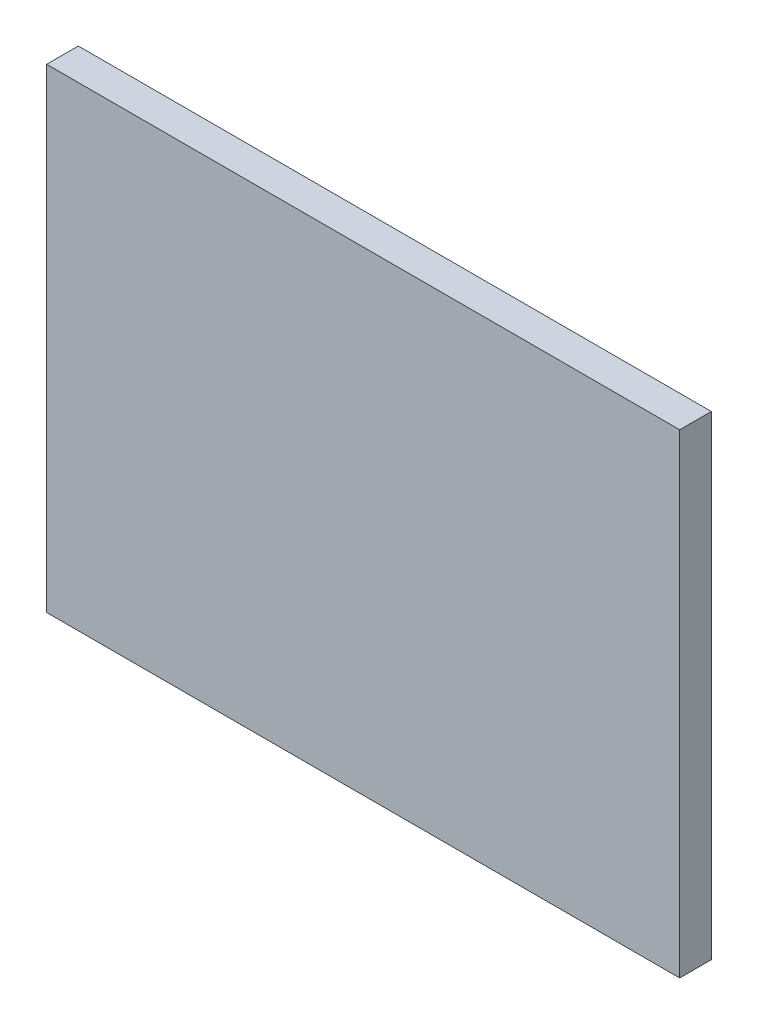
ISO-10303-21;
HEADER;
FILE_DESCRIPTION(('STEP AP214'),'2;1');
FILE_NAME('part.step','',(''),(''),'','','');
FILE_SCHEMA(('AUTOMOTIVE_DESIGN { 1 0 10303 214 1 1 1 1 }'));
ENDSEC;
DATA;
#1=APPLICATION_CONTEXT('core data for automotive mechanical design processes');
#2=APPLICATION_PROTOCOL_DEFINITION('international standard','automotive_design',2000,#1);
#3=PRODUCT_CONTEXT('',#1,'mechanical');
#4=PRODUCT('Part','Part','',(#3));
#5=PRODUCT_RELATED_PRODUCT_CATEGORY('part','',(#4));
#6=PRODUCT_DEFINITION_FORMATION('','',#4);
#7=PRODUCT_DEFINITION_CONTEXT('part definition',#1,'design');
#8=PRODUCT_DEFINITION('design','',#6,#7);
#9=PRODUCT_DEFINITION_SHAPE('','',#8);
#10=(LENGTH_UNIT() NAMED_UNIT(*) SI_UNIT(.MILLI.,.METRE.));
#11=(NAMED_UNIT(*) PLANE_ANGLE_UNIT() SI_UNIT($,.RADIAN.));
#12=(NAMED_UNIT(*) SI_UNIT($,.STERADIAN.) SOLID_ANGLE_UNIT());
#13=UNCERTAINTY_MEASURE_WITH_UNIT(LENGTH_MEASURE(1.E-05),#10,'distance_accuracy_value','');
#14=(GEOMETRIC_REPRESENTATION_CONTEXT(3) GLOBAL_UNCERTAINTY_ASSIGNED_CONTEXT((#13)) GLOBAL_UNIT_ASSIGNED_CONTEXT((#10,
#11,#12)) REPRESENTATION_CONTEXT('',''));
#15=CARTESIAN_POINT('',(0.,0.,0.));
#16=DIRECTION('',(0.,0.,1.));
#17=DIRECTION('',(1.,0.,0.));
#18=AXIS2_PLACEMENT_3D('',#15,#16,#17);
#19=CARTESIAN_POINT('',(0.,0.,5.08));
#20=DIRECTION('',(1.,0.,0.));
#21=DIRECTION('',(0.,1.,0.));
#22=AXIS2_PLACEMENT_3D('',#19,#20,#21);
#23=PLANE('',#22);
#24=DIRECTION('',(0.,-1.,0.));
#25=VECTOR('',#24,1.);
#26=CARTESIAN_POINT('',(0.,0.,0.));
#27=LINE('',#26,#25);
#28=CARTESIAN_POINT('',(0.,76.2,0.));
#29=VERTEX_POINT('',#28);
#30=CARTESIAN_POINT('',(0.,0.,0.));
#31=VERTEX_POINT('',#30);
#32=EDGE_CURVE('E98',#29,#31,#27,.T.);
#33=ORIENTED_EDGE('',*,*,#32,.T.);
#34=DIRECTION('',(0.,0.,-1.));
#35=VECTOR('',#34,1.);
#36=CARTESIAN_POINT('',(0.,0.,5.08));
#37=LINE('',#36,#35);
#38=CARTESIAN_POINT('',(0.,0.,5.08));
#39=VERTEX_POINT('',#38);
#40=EDGE_CURVE('E11',#39,#31,#37,.T.);
#41=ORIENTED_EDGE('',*,*,#40,.F.);
#42=DIRECTION('',(0.,-1.,0.));
#43=VECTOR('',#42,1.);
#44=CARTESIAN_POINT('',(0.,0.,5.08));
#45=LINE('',#44,#43);
#46=CARTESIAN_POINT('',(0.,76.2,5.08));
#47=VERTEX_POINT('',#46);
#48=EDGE_CURVE('E86',#47,#39,#45,.T.);
#49=ORIENTED_EDGE('',*,*,#48,.F.);
#50=DIRECTION('',(0.,0.,-1.));
#51=VECTOR('',#50,1.);
#52=CARTESIAN_POINT('',(0.,76.2,5.08));
#53=LINE('',#52,#51);
#54=EDGE_CURVE('E94',#47,#29,#53,.T.);
#55=ORIENTED_EDGE('',*,*,#54,.T.);
#56=EDGE_LOOP('',(#33,#41,#49,#55));
#57=FACE_BOUND('',#56,.T.);
#58=ADVANCED_FACE('F35',(#57),#23,.F.);
#59=CARTESIAN_POINT('',(0.,0.,5.08));
#60=DIRECTION('',(0.,1.,0.));
#61=DIRECTION('',(0.,0.,1.));
#62=AXIS2_PLACEMENT_3D('',#59,#60,#61);
#63=PLANE('',#62);
#64=DIRECTION('',(1.,0.,0.));
#65=VECTOR('',#64,1.);
#66=CARTESIAN_POINT('',(0.,0.,0.));
#67=LINE('',#66,#65);
#68=CARTESIAN_POINT('',(101.6,0.,0.));
#69=VERTEX_POINT('',#68);
#70=EDGE_CURVE('E90',#31,#69,#67,.T.);
#71=ORIENTED_EDGE('',*,*,#70,.T.);
#72=DIRECTION('',(0.,0.,-1.));
#73=VECTOR('',#72,1.);
#74=CARTESIAN_POINT('',(101.6,0.,5.08));
#75=LINE('',#74,#73);
#76=CARTESIAN_POINT('',(101.6,0.,5.08));
#77=VERTEX_POINT('',#76);
#78=EDGE_CURVE('E43',#77,#69,#75,.T.);
#79=ORIENTED_EDGE('',*,*,#78,.F.);
#80=DIRECTION('',(1.,0.,0.));
#81=VECTOR('',#80,1.);
#82=CARTESIAN_POINT('',(0.,0.,5.08));
#83=LINE('',#82,#81);
#84=EDGE_CURVE('E81',#39,#77,#83,.T.);
#85=ORIENTED_EDGE('',*,*,#84,.F.);
#86=ORIENTED_EDGE('',*,*,#40,.T.);
#87=EDGE_LOOP('',(#71,#79,#85,#86));
#88=FACE_BOUND('',#87,.T.);
#89=ADVANCED_FACE('F89',(#88),#63,.F.);
#90=CARTESIAN_POINT('',(101.6,0.,5.08));
#91=DIRECTION('',(-1.,0.,0.));
#92=DIRECTION('',(0.,-1.,0.));
#93=AXIS2_PLACEMENT_3D('',#90,#91,#92);
#94=PLANE('',#93);
#95=DIRECTION('',(0.,1.,0.));
#96=VECTOR('',#95,1.);
#97=CARTESIAN_POINT('',(101.6,0.,0.));
#98=LINE('',#97,#96);
#99=CARTESIAN_POINT('',(101.6,76.2,0.));
#100=VERTEX_POINT('',#99);
#101=EDGE_CURVE('E68',#69,#100,#98,.T.);
#102=ORIENTED_EDGE('',*,*,#101,.T.);
#103=DIRECTION('',(0.,0.,-1.));
#104=VECTOR('',#103,1.);
#105=CARTESIAN_POINT('',(101.6,76.2,5.08));
#106=LINE('',#105,#104);
#107=CARTESIAN_POINT('',(101.6,76.2,5.08));
#108=VERTEX_POINT('',#107);
#109=EDGE_CURVE('E91',#108,#100,#106,.T.);
#110=ORIENTED_EDGE('',*,*,#109,.F.);
#111=DIRECTION('',(0.,1.,0.));
#112=VECTOR('',#111,1.);
#113=CARTESIAN_POINT('',(101.6,0.,5.08));
#114=LINE('',#113,#112);
#115=EDGE_CURVE('E84',#77,#108,#114,.T.);
#116=ORIENTED_EDGE('',*,*,#115,.F.);
#117=ORIENTED_EDGE('',*,*,#78,.T.);
#118=EDGE_LOOP('',(#102,#110,#116,#117));
#119=FACE_BOUND('',#118,.T.);
#120=ADVANCED_FACE('F92',(#119),#94,.F.);
#121=CARTESIAN_POINT('',(0.,76.2,5.08));
#122=DIRECTION('',(0.,-1.,0.));
#123=DIRECTION('',(0.,0.,-1.));
#124=AXIS2_PLACEMENT_3D('',#121,#122,#123);
#125=PLANE('',#124);
#126=DIRECTION('',(-1.,0.,0.));
#127=VECTOR('',#126,1.);
#128=CARTESIAN_POINT('',(0.,76.2,0.));
#129=LINE('',#128,#127);
#130=EDGE_CURVE('E74',#100,#29,#129,.T.);
#131=ORIENTED_EDGE('',*,*,#130,.T.);
#132=ORIENTED_EDGE('',*,*,#54,.F.);
#133=DIRECTION('',(-1.,0.,0.));
#134=VECTOR('',#133,1.);
#135=CARTESIAN_POINT('',(0.,76.2,5.08));
#136=LINE('',#135,#134);
#137=EDGE_CURVE('E51',#108,#47,#136,.T.);
#138=ORIENTED_EDGE('',*,*,#137,.F.);
#139=ORIENTED_EDGE('',*,*,#109,.T.);
#140=EDGE_LOOP('',(#131,#132,#138,#139));
#141=FACE_BOUND('',#140,.T.);
#142=ADVANCED_FACE('F105',(#141),#125,.F.);
#143=CARTESIAN_POINT('',(0.,0.,5.08));
#144=DIRECTION('',(0.,0.,-1.));
#145=DIRECTION('',(-1.,0.,0.));
#146=AXIS2_PLACEMENT_3D('',#143,#144,#145);
#147=PLANE('',#146);
#148=ORIENTED_EDGE('',*,*,#48,.T.);
#149=ORIENTED_EDGE('',*,*,#84,.T.);
#150=ORIENTED_EDGE('',*,*,#115,.T.);
#151=ORIENTED_EDGE('',*,*,#137,.T.);
#152=EDGE_LOOP('',(#148,#149,#150,#151));
#153=FACE_BOUND('',#152,.T.);
#154=ADVANCED_FACE('F82',(#153),#147,.F.);
#155=CARTESIAN_POINT('',(0.,0.,0.));
#156=DIRECTION('',(0.,0.,-1.));
#157=DIRECTION('',(-1.,0.,0.));
#158=AXIS2_PLACEMENT_3D('',#155,#156,#157);
#159=PLANE('',#158);
#160=ORIENTED_EDGE('',*,*,#32,.F.);
#161=ORIENTED_EDGE('',*,*,#130,.F.);
#162=ORIENTED_EDGE('',*,*,#101,.F.);
#163=ORIENTED_EDGE('',*,*,#70,.F.);
#164=EDGE_LOOP('',(#160,#161,#162,#163));
#165=FACE_BOUND('',#164,.T.);
#166=ADVANCED_FACE('F108',(#165),#159,.T.);
#167=CLOSED_SHELL('',(#58,#89,#120,#142,#154,#166));
#168=MANIFOLD_SOLID_BREP('B2',#167);
#169=ADVANCED_BREP_SHAPE_REPRESENTATION('',(#18,#168),#14);
#170=SHAPE_DEFINITION_REPRESENTATION(#9,#169);
ENDSEC;
END-ISO-10303-21;
